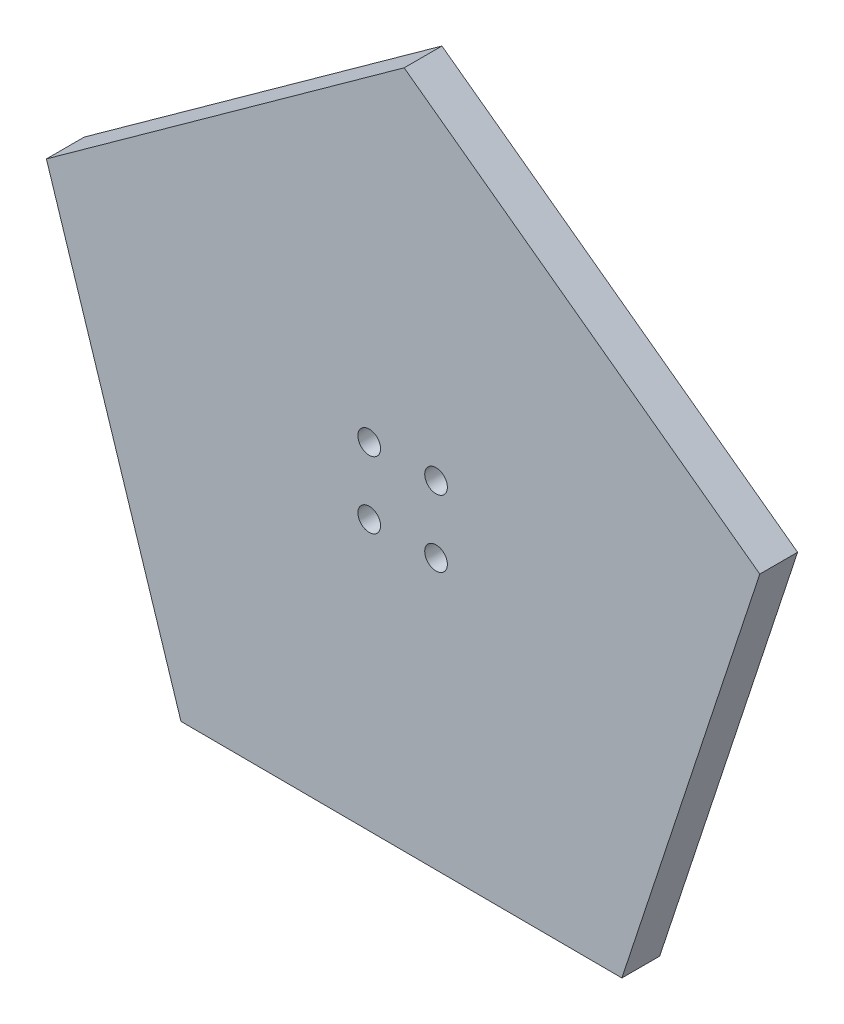
ISO-10303-21;
HEADER;
FILE_DESCRIPTION(('STEP AP214'),'2;1');
FILE_NAME('part.step','',(''),(''),'','','');
FILE_SCHEMA(('AUTOMOTIVE_DESIGN { 1 0 10303 214 1 1 1 1 }'));
ENDSEC;
DATA;
#1=APPLICATION_CONTEXT('core data for automotive mechanical design processes');
#2=APPLICATION_PROTOCOL_DEFINITION('international standard','automotive_design',2000,#1);
#3=PRODUCT_CONTEXT('',#1,'mechanical');
#4=PRODUCT('Part','Part','',(#3));
#5=PRODUCT_RELATED_PRODUCT_CATEGORY('part','',(#4));
#6=PRODUCT_DEFINITION_FORMATION('','',#4);
#7=PRODUCT_DEFINITION_CONTEXT('part definition',#1,'design');
#8=PRODUCT_DEFINITION('design','',#6,#7);
#9=PRODUCT_DEFINITION_SHAPE('','',#8);
#10=(LENGTH_UNIT() NAMED_UNIT(*) SI_UNIT(.MILLI.,.METRE.));
#11=(NAMED_UNIT(*) PLANE_ANGLE_UNIT() SI_UNIT($,.RADIAN.));
#12=(NAMED_UNIT(*) SI_UNIT($,.STERADIAN.) SOLID_ANGLE_UNIT());
#13=UNCERTAINTY_MEASURE_WITH_UNIT(LENGTH_MEASURE(1.E-05),#10,'distance_accuracy_value','');
#14=(GEOMETRIC_REPRESENTATION_CONTEXT(3) GLOBAL_UNCERTAINTY_ASSIGNED_CONTEXT((#13)) GLOBAL_UNIT_ASSIGNED_CONTEXT((#10,
#11,#12)) REPRESENTATION_CONTEXT('',''));
#15=CARTESIAN_POINT('',(0.,0.,0.));
#16=DIRECTION('',(0.,0.,1.));
#17=DIRECTION('',(1.,0.,0.));
#18=AXIS2_PLACEMENT_3D('',#15,#16,#17);
#19=CARTESIAN_POINT('',(28.3521778590598,9.08693225967734,3.));
#20=DIRECTION('',(-0.591017363980425,-0.806658834621942,0.));
#21=DIRECTION('',(0.806658834621942,-0.591017363980425,0.));
#22=AXIS2_PLACEMENT_3D('',#19,#20,#21);
#23=PLANE('',#22);
#24=DIRECTION('',(-0.806658834621942,0.591017363980425,0.));
#25=VECTOR('',#24,1.);
#26=CARTESIAN_POINT('',(28.3521778590598,9.08693225967734,0.));
#27=LINE('',#26,#25);
#28=CARTESIAN_POINT('',(28.3521778590598,9.08693225967734,0.));
#29=VERTEX_POINT('',#28);
#30=CARTESIAN_POINT('',(0.119118647291773,29.7725399989922,0.));
#31=VERTEX_POINT('',#30);
#32=EDGE_CURVE('E107',#29,#31,#27,.T.);
#33=ORIENTED_EDGE('',*,*,#32,.T.);
#34=DIRECTION('',(0.,0.,-1.));
#35=VECTOR('',#34,1.);
#36=CARTESIAN_POINT('',(0.119118647291773,29.7725399989922,3.));
#37=LINE('',#36,#35);
#38=CARTESIAN_POINT('',(0.119118647291773,29.7725399989922,3.));
#39=VERTEX_POINT('',#38);
#40=EDGE_CURVE('E11',#39,#31,#37,.T.);
#41=ORIENTED_EDGE('',*,*,#40,.F.);
#42=DIRECTION('',(-0.806658834621942,0.591017363980425,0.));
#43=VECTOR('',#42,1.);
#44=CARTESIAN_POINT('',(28.3521778590598,9.08693225967734,3.));
#45=LINE('',#44,#43);
#46=CARTESIAN_POINT('',(28.3521778590598,9.08693225967734,3.));
#47=VERTEX_POINT('',#46);
#48=EDGE_CURVE('E116',#47,#39,#45,.T.);
#49=ORIENTED_EDGE('',*,*,#48,.F.);
#50=DIRECTION('',(0.,0.,-1.));
#51=VECTOR('',#50,1.);
#52=CARTESIAN_POINT('',(28.3521778590598,9.08693225967734,3.));
#53=LINE('',#52,#51);
#54=EDGE_CURVE('E103',#47,#29,#53,.T.);
#55=ORIENTED_EDGE('',*,*,#54,.T.);
#56=EDGE_LOOP('',(#33,#41,#49,#55));
#57=FACE_BOUND('',#56,.T.);
#58=ADVANCED_FACE('F33',(#57),#23,.F.);
#59=CARTESIAN_POINT('',(0.119118647291773,29.7725399989922,3.));
#60=DIRECTION('',(0.584543731653618,-0.811362203818038,0.));
#61=DIRECTION('',(0.811362203818038,0.584543731653618,0.));
#62=AXIS2_PLACEMENT_3D('',#59,#60,#61);
#63=PLANE('',#62);
#64=DIRECTION('',(-0.811362203818038,-0.584543731653618,0.));
#65=VECTOR('',#64,1.);
#66=CARTESIAN_POINT('',(0.119118647291773,29.7725399989922,0.));
#67=LINE('',#66,#65);
#68=CARTESIAN_POINT('',(-28.2785584863395,9.3135093911156,0.));
#69=VERTEX_POINT('',#68);
#70=EDGE_CURVE('E110',#31,#69,#67,.T.);
#71=ORIENTED_EDGE('',*,*,#70,.T.);
#72=DIRECTION('',(0.,0.,-1.));
#73=VECTOR('',#72,1.);
#74=CARTESIAN_POINT('',(-28.2785584863395,9.3135093911156,3.));
#75=LINE('',#74,#73);
#76=CARTESIAN_POINT('',(-28.2785584863395,9.3135093911156,3.));
#77=VERTEX_POINT('',#76);
#78=EDGE_CURVE('E41',#77,#69,#75,.T.);
#79=ORIENTED_EDGE('',*,*,#78,.F.);
#80=DIRECTION('',(-0.811362203818038,-0.584543731653618,0.));
#81=VECTOR('',#80,1.);
#82=CARTESIAN_POINT('',(0.119118647291773,29.7725399989922,3.));
#83=LINE('',#82,#81);
#84=EDGE_CURVE('E83',#39,#77,#83,.T.);
#85=ORIENTED_EDGE('',*,*,#84,.F.);
#86=ORIENTED_EDGE('',*,*,#40,.T.);
#87=EDGE_LOOP('',(#71,#79,#85,#86));
#88=FACE_BOUND('',#87,.T.);
#89=ADVANCED_FACE('F136',(#88),#63,.F.);
#90=CARTESIAN_POINT('',(-28.2785584863395,9.3135093911156,3.));
#91=DIRECTION('',(0.952285258053058,0.305209415475376,0.));
#92=DIRECTION('',(-0.305209415475376,0.952285258053058,0.));
#93=AXIS2_PLACEMENT_3D('',#90,#91,#92);
#94=PLANE('',#93);
#95=DIRECTION('',(0.305209415475376,-0.952285258053058,0.));
#96=VECTOR('',#95,1.);
#97=CARTESIAN_POINT('',(-28.2785584863395,9.3135093911156,0.));
#98=LINE('',#97,#96);
#99=CARTESIAN_POINT('',(-17.5962289447014,-24.0164746407414,0.));
#100=VERTEX_POINT('',#99);
#101=EDGE_CURVE('E98',#69,#100,#98,.T.);
#102=ORIENTED_EDGE('',*,*,#101,.T.);
#103=DIRECTION('',(0.,0.,-1.));
#104=VECTOR('',#103,1.);
#105=CARTESIAN_POINT('',(-17.5962289447014,-24.0164746407414,3.));
#106=LINE('',#105,#104);
#107=CARTESIAN_POINT('',(-17.5962289447014,-24.0164746407414,3.));
#108=VERTEX_POINT('',#107);
#109=EDGE_CURVE('E95',#108,#100,#106,.T.);
#110=ORIENTED_EDGE('',*,*,#109,.F.);
#111=DIRECTION('',(0.305209415475376,-0.952285258053058,0.));
#112=VECTOR('',#111,1.);
#113=CARTESIAN_POINT('',(-28.2785584863395,9.3135093911156,3.));
#114=LINE('',#113,#112);
#115=EDGE_CURVE('E87',#77,#108,#114,.T.);
#116=ORIENTED_EDGE('',*,*,#115,.F.);
#117=ORIENTED_EDGE('',*,*,#78,.T.);
#118=EDGE_LOOP('',(#102,#110,#116,#117));
#119=FACE_BOUND('',#118,.T.);
#120=ADVANCED_FACE('F96',(#119),#94,.F.);
#121=CARTESIAN_POINT('',(-17.5962289447014,-24.0164746407414,3.));
#122=DIRECTION('',(0.00400092480863645,0.999991996268308,0.));
#123=DIRECTION('',(-0.999991996268308,0.00400092480863645,0.));
#124=AXIS2_PLACEMENT_3D('',#121,#122,#123);
#125=PLANE('',#124);
#126=DIRECTION('',(0.999991996268308,-0.00400092480863645,0.));
#127=VECTOR('',#126,1.);
#128=CARTESIAN_POINT('',(-17.5962289447014,-24.0164746407414,0.));
#129=LINE('',#128,#127);
#130=CARTESIAN_POINT('',(17.4034909246894,-24.1565070090437,0.));
#131=VERTEX_POINT('',#130);
#132=EDGE_CURVE('E69',#100,#131,#129,.T.);
#133=ORIENTED_EDGE('',*,*,#132,.T.);
#134=DIRECTION('',(0.,0.,-1.));
#135=VECTOR('',#134,1.);
#136=CARTESIAN_POINT('',(17.4034909246894,-24.1565070090437,3.));
#137=LINE('',#136,#135);
#138=CARTESIAN_POINT('',(17.4034909246894,-24.1565070090437,3.));
#139=VERTEX_POINT('',#138);
#140=EDGE_CURVE('E99',#139,#131,#137,.T.);
#141=ORIENTED_EDGE('',*,*,#140,.F.);
#142=DIRECTION('',(0.999991996268308,-0.00400092480863645,0.));
#143=VECTOR('',#142,1.);
#144=CARTESIAN_POINT('',(-17.5962289447014,-24.0164746407414,3.));
#145=LINE('',#144,#143);
#146=EDGE_CURVE('E91',#108,#139,#145,.T.);
#147=ORIENTED_EDGE('',*,*,#146,.F.);
#148=ORIENTED_EDGE('',*,*,#109,.T.);
#149=EDGE_LOOP('',(#133,#141,#147,#148));
#150=FACE_BOUND('',#149,.T.);
#151=ADVANCED_FACE('F101',(#150),#125,.F.);
#152=CARTESIAN_POINT('',(17.4034909246894,-24.1565070090437,3.));
#153=DIRECTION('',(-0.949812550534888,0.312819626696297,0.));
#154=DIRECTION('',(-0.312819626696297,-0.949812550534888,0.));
#155=AXIS2_PLACEMENT_3D('',#152,#153,#154);
#156=PLANE('',#155);
#157=DIRECTION('',(0.312819626696297,0.949812550534888,0.));
#158=VECTOR('',#157,1.);
#159=CARTESIAN_POINT('',(17.4034909246894,-24.1565070090437,0.));
#160=LINE('',#159,#158);
#161=EDGE_CURVE('E75',#131,#29,#160,.T.);
#162=ORIENTED_EDGE('',*,*,#161,.T.);
#163=ORIENTED_EDGE('',*,*,#54,.F.);
#164=DIRECTION('',(0.312819626696297,0.949812550534888,0.));
#165=VECTOR('',#164,1.);
#166=CARTESIAN_POINT('',(17.4034909246894,-24.1565070090437,3.));
#167=LINE('',#166,#165);
#168=EDGE_CURVE('E49',#139,#47,#167,.T.);
#169=ORIENTED_EDGE('',*,*,#168,.F.);
#170=ORIENTED_EDGE('',*,*,#140,.T.);
#171=EDGE_LOOP('',(#162,#163,#169,#170));
#172=FACE_BOUND('',#171,.T.);
#173=ADVANCED_FACE('F124',(#172),#156,.F.);
#174=CARTESIAN_POINT('',(0.,0.,3.));
#175=DIRECTION('',(0.,0.,1.));
#176=DIRECTION('',(1.,0.,0.));
#177=AXIS2_PLACEMENT_3D('',#174,#175,#176);
#178=PLANE('',#177);
#179=CARTESIAN_POINT('',(-2.65165042944958,2.65165042944953,3.));
#180=DIRECTION('',(0.,0.,-1.));
#181=DIRECTION('',(-1.,0.,0.));
#182=AXIS2_PLACEMENT_3D('',#179,#180,#181);
#183=CIRCLE('',#182,0.899999999999999);
#184=CARTESIAN_POINT('',(-3.55165042944958,2.65165042944953,3.));
#185=VERTEX_POINT('',#184);
#186=EDGE_CURVE('E215',#185,#185,#183,.T.);
#187=ORIENTED_EDGE('',*,*,#186,.T.);
#188=EDGE_LOOP('',(#187));
#189=FACE_BOUND('',#188,.T.);
#190=CARTESIAN_POINT('',(2.65165042944953,2.65165042944957,3.));
#191=DIRECTION('',(0.,0.,-1.));
#192=DIRECTION('',(-1.,0.,0.));
#193=AXIS2_PLACEMENT_3D('',#190,#191,#192);
#194=CIRCLE('',#193,0.9);
#195=CARTESIAN_POINT('',(1.75165042944953,2.65165042944957,3.));
#196=VERTEX_POINT('',#195);
#197=EDGE_CURVE('E238',#196,#196,#194,.T.);
#198=ORIENTED_EDGE('',*,*,#197,.T.);
#199=EDGE_LOOP('',(#198));
#200=FACE_BOUND('',#199,.T.);
#201=CARTESIAN_POINT('',(2.65165042944956,-2.65165042944954,3.));
#202=DIRECTION('',(0.,0.,-1.));
#203=DIRECTION('',(-1.,0.,0.));
#204=AXIS2_PLACEMENT_3D('',#201,#202,#203);
#205=CIRCLE('',#204,0.899999999999999);
#206=CARTESIAN_POINT('',(1.75165042944956,-2.65165042944954,3.));
#207=VERTEX_POINT('',#206);
#208=EDGE_CURVE('E229',#207,#207,#205,.T.);
#209=ORIENTED_EDGE('',*,*,#208,.T.);
#210=EDGE_LOOP('',(#209));
#211=FACE_BOUND('',#210,.T.);
#212=CARTESIAN_POINT('',(-2.65165042944955,-2.65165042944955,3.));
#213=DIRECTION('',(0.,0.,-1.));
#214=DIRECTION('',(-1.,0.,0.));
#215=AXIS2_PLACEMENT_3D('',#212,#213,#214);
#216=CIRCLE('',#215,0.899999999999999);
#217=CARTESIAN_POINT('',(-3.55165042944955,-2.65165042944955,3.));
#218=VERTEX_POINT('',#217);
#219=EDGE_CURVE('E111',#218,#218,#216,.T.);
#220=ORIENTED_EDGE('',*,*,#219,.T.);
#221=EDGE_LOOP('',(#220));
#222=FACE_BOUND('',#221,.T.);
#223=ORIENTED_EDGE('',*,*,#48,.T.);
#224=ORIENTED_EDGE('',*,*,#84,.T.);
#225=ORIENTED_EDGE('',*,*,#115,.T.);
#226=ORIENTED_EDGE('',*,*,#146,.T.);
#227=ORIENTED_EDGE('',*,*,#168,.T.);
#228=EDGE_LOOP('',(#223,#224,#225,#226,#227));
#229=FACE_BOUND('',#228,.T.);
#230=ADVANCED_FACE('F89',(#189,#200,#211,#222,#229),#178,.T.);
#231=CARTESIAN_POINT('',(0.,0.,0.));
#232=DIRECTION('',(0.,0.,1.));
#233=DIRECTION('',(1.,0.,0.));
#234=AXIS2_PLACEMENT_3D('',#231,#232,#233);
#235=PLANE('',#234);
#236=CARTESIAN_POINT('',(-2.65165042944958,2.65165042944953,0.));
#237=DIRECTION('',(0.,0.,-1.));
#238=DIRECTION('',(-1.,0.,0.));
#239=AXIS2_PLACEMENT_3D('',#236,#237,#238);
#240=CIRCLE('',#239,0.899999999999999);
#241=CARTESIAN_POINT('',(-3.55165042944958,2.65165042944953,0.));
#242=VERTEX_POINT('',#241);
#243=EDGE_CURVE('E218',#242,#242,#240,.T.);
#244=ORIENTED_EDGE('',*,*,#243,.F.);
#245=EDGE_LOOP('',(#244));
#246=FACE_BOUND('',#245,.T.);
#247=CARTESIAN_POINT('',(2.65165042944953,2.65165042944957,0.));
#248=DIRECTION('',(0.,0.,-1.));
#249=DIRECTION('',(-1.,0.,0.));
#250=AXIS2_PLACEMENT_3D('',#247,#248,#249);
#251=CIRCLE('',#250,0.9);
#252=CARTESIAN_POINT('',(1.75165042944953,2.65165042944957,0.));
#253=VERTEX_POINT('',#252);
#254=EDGE_CURVE('E220',#253,#253,#251,.T.);
#255=ORIENTED_EDGE('',*,*,#254,.F.);
#256=EDGE_LOOP('',(#255));
#257=FACE_BOUND('',#256,.T.);
#258=CARTESIAN_POINT('',(2.65165042944956,-2.65165042944954,0.));
#259=DIRECTION('',(0.,0.,-1.));
#260=DIRECTION('',(-1.,0.,0.));
#261=AXIS2_PLACEMENT_3D('',#258,#259,#260);
#262=CIRCLE('',#261,0.899999999999999);
#263=CARTESIAN_POINT('',(1.75165042944956,-2.65165042944954,0.));
#264=VERTEX_POINT('',#263);
#265=EDGE_CURVE('E233',#264,#264,#262,.T.);
#266=ORIENTED_EDGE('',*,*,#265,.F.);
#267=EDGE_LOOP('',(#266));
#268=FACE_BOUND('',#267,.T.);
#269=CARTESIAN_POINT('',(-2.65165042944955,-2.65165042944955,0.));
#270=DIRECTION('',(0.,0.,-1.));
#271=DIRECTION('',(-1.,0.,0.));
#272=AXIS2_PLACEMENT_3D('',#269,#270,#271);
#273=CIRCLE('',#272,0.899999999999999);
#274=CARTESIAN_POINT('',(-3.55165042944955,-2.65165042944955,0.));
#275=VERTEX_POINT('',#274);
#276=EDGE_CURVE('E226',#275,#275,#273,.T.);
#277=ORIENTED_EDGE('',*,*,#276,.F.);
#278=EDGE_LOOP('',(#277));
#279=FACE_BOUND('',#278,.T.);
#280=ORIENTED_EDGE('',*,*,#32,.F.);
#281=ORIENTED_EDGE('',*,*,#161,.F.);
#282=ORIENTED_EDGE('',*,*,#132,.F.);
#283=ORIENTED_EDGE('',*,*,#101,.F.);
#284=ORIENTED_EDGE('',*,*,#70,.F.);
#285=EDGE_LOOP('',(#280,#281,#282,#283,#284));
#286=FACE_BOUND('',#285,.T.);
#287=ADVANCED_FACE('F120',(#246,#257,#268,#279,#286),#235,.F.);
#288=CARTESIAN_POINT('',(-2.65165042944955,-2.65165042944955,3.));
#289=DIRECTION('',(0.,0.,-1.));
#290=DIRECTION('',(-1.,0.,0.));
#291=AXIS2_PLACEMENT_3D('',#288,#289,#290);
#292=CYLINDRICAL_SURFACE('',#291,0.899999999999999);
#293=ORIENTED_EDGE('',*,*,#219,.F.);
#294=EDGE_LOOP('',(#293));
#295=FACE_BOUND('',#294,.T.);
#296=ORIENTED_EDGE('',*,*,#276,.T.);
#297=EDGE_LOOP('',(#296));
#298=FACE_BOUND('',#297,.T.);
#299=ADVANCED_FACE('F169',(#295,#298),#292,.F.);
#300=CARTESIAN_POINT('',(2.65165042944956,-2.65165042944954,3.));
#301=DIRECTION('',(0.,0.,-1.));
#302=DIRECTION('',(-1.,0.,0.));
#303=AXIS2_PLACEMENT_3D('',#300,#301,#302);
#304=CYLINDRICAL_SURFACE('',#303,0.899999999999999);
#305=ORIENTED_EDGE('',*,*,#208,.F.);
#306=EDGE_LOOP('',(#305));
#307=FACE_BOUND('',#306,.T.);
#308=ORIENTED_EDGE('',*,*,#265,.T.);
#309=EDGE_LOOP('',(#308));
#310=FACE_BOUND('',#309,.T.);
#311=ADVANCED_FACE('F178',(#307,#310),#304,.F.);
#312=CARTESIAN_POINT('',(2.65165042944953,2.65165042944957,3.));
#313=DIRECTION('',(0.,0.,-1.));
#314=DIRECTION('',(-1.,0.,0.));
#315=AXIS2_PLACEMENT_3D('',#312,#313,#314);
#316=CYLINDRICAL_SURFACE('',#315,0.9);
#317=ORIENTED_EDGE('',*,*,#197,.F.);
#318=EDGE_LOOP('',(#317));
#319=FACE_BOUND('',#318,.T.);
#320=ORIENTED_EDGE('',*,*,#254,.T.);
#321=EDGE_LOOP('',(#320));
#322=FACE_BOUND('',#321,.T.);
#323=ADVANCED_FACE('F188',(#319,#322),#316,.F.);
#324=CARTESIAN_POINT('',(-2.65165042944958,2.65165042944953,3.));
#325=DIRECTION('',(0.,0.,-1.));
#326=DIRECTION('',(-1.,0.,0.));
#327=AXIS2_PLACEMENT_3D('',#324,#325,#326);
#328=CYLINDRICAL_SURFACE('',#327,0.899999999999999);
#329=ORIENTED_EDGE('',*,*,#186,.F.);
#330=EDGE_LOOP('',(#329));
#331=FACE_BOUND('',#330,.T.);
#332=ORIENTED_EDGE('',*,*,#243,.T.);
#333=EDGE_LOOP('',(#332));
#334=FACE_BOUND('',#333,.T.);
#335=ADVANCED_FACE('F198',(#331,#334),#328,.F.);
#336=CLOSED_SHELL('',(#58,#89,#120,#151,#173,#230,#287,#299,#311,#323,#335));
#337=MANIFOLD_SOLID_BREP('B2',#336);
#338=ADVANCED_BREP_SHAPE_REPRESENTATION('',(#18,#337),#14);
#339=SHAPE_DEFINITION_REPRESENTATION(#9,#338);
ENDSEC;
END-ISO-10303-21;
